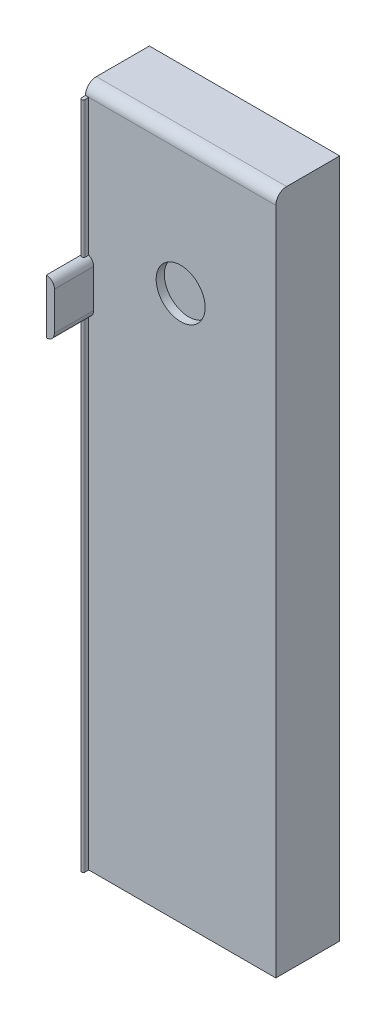
ISO-10303-21;
HEADER;
FILE_DESCRIPTION(('STEP AP214'),'2;1');
FILE_NAME('part.step','',(''),(''),'','','');
FILE_SCHEMA(('AUTOMOTIVE_DESIGN { 1 0 10303 214 1 1 1 1 }'));
ENDSEC;
DATA;
#1=APPLICATION_CONTEXT('core data for automotive mechanical design processes');
#2=APPLICATION_PROTOCOL_DEFINITION('international standard','automotive_design',2000,#1);
#3=PRODUCT_CONTEXT('',#1,'mechanical');
#4=PRODUCT('Part','Part','',(#3));
#5=PRODUCT_RELATED_PRODUCT_CATEGORY('part','',(#4));
#6=PRODUCT_DEFINITION_FORMATION('','',#4);
#7=PRODUCT_DEFINITION_CONTEXT('part definition',#1,'design');
#8=PRODUCT_DEFINITION('design','',#6,#7);
#9=PRODUCT_DEFINITION_SHAPE('','',#8);
#10=(LENGTH_UNIT() NAMED_UNIT(*) SI_UNIT(.MILLI.,.METRE.));
#11=(NAMED_UNIT(*) PLANE_ANGLE_UNIT() SI_UNIT($,.RADIAN.));
#12=(NAMED_UNIT(*) SI_UNIT($,.STERADIAN.) SOLID_ANGLE_UNIT());
#13=UNCERTAINTY_MEASURE_WITH_UNIT(LENGTH_MEASURE(1.E-05),#10,'distance_accuracy_value','');
#14=(GEOMETRIC_REPRESENTATION_CONTEXT(3) GLOBAL_UNCERTAINTY_ASSIGNED_CONTEXT((#13)) GLOBAL_UNIT_ASSIGNED_CONTEXT((#10,
#11,#12)) REPRESENTATION_CONTEXT('',''));
#15=CARTESIAN_POINT('',(0.,0.,0.));
#16=DIRECTION('',(0.,0.,1.));
#17=DIRECTION('',(1.,0.,0.));
#18=AXIS2_PLACEMENT_3D('',#15,#16,#17);
#19=CARTESIAN_POINT('',(-175.,270.25,-2.00025181603299E-13));
#20=DIRECTION('',(0.,0.,1.));
#21=DIRECTION('',(0.,-1.,0.));
#22=AXIS2_PLACEMENT_3D('',#19,#20,#21);
#23=CYLINDRICAL_SURFACE('',#22,15.);
#24=DIRECTION('',(0.,0.,-1.));
#25=VECTOR('',#24,1.);
#26=CARTESIAN_POINT('',(-160.,270.25,-2.00025181603299E-13));
#27=LINE('',#26,#25);
#28=CARTESIAN_POINT('',(-160.,270.25,189.586261152652));
#29=VERTEX_POINT('',#28);
#30=CARTESIAN_POINT('',(-160.,270.25,117.5));
#31=VERTEX_POINT('',#30);
#32=EDGE_CURVE('E473',#29,#31,#27,.T.);
#33=ORIENTED_EDGE('',*,*,#32,.F.);
#34=CARTESIAN_POINT('',(-175.,270.25,189.586261152652));
#35=DIRECTION('',(0.,0.,-1.));
#36=DIRECTION('',(0.,1.,0.));
#37=AXIS2_PLACEMENT_3D('',#34,#35,#36);
#38=CIRCLE('',#37,15.);
#39=CARTESIAN_POINT('',(-175.,255.25,189.586261152652));
#40=VERTEX_POINT('',#39);
#41=EDGE_CURVE('E389',#40,#29,#38,.F.);
#42=ORIENTED_EDGE('',*,*,#41,.F.);
#43=DIRECTION('',(0.,0.,1.));
#44=VECTOR('',#43,1.);
#45=CARTESIAN_POINT('',(-175.,255.25,-1.88922951357047E-13));
#46=LINE('',#45,#44);
#47=CARTESIAN_POINT('',(-175.,255.25,124.5));
#48=VERTEX_POINT('',#47);
#49=EDGE_CURVE('E398',#48,#40,#46,.T.);
#50=ORIENTED_EDGE('',*,*,#49,.F.);
#51=CARTESIAN_POINT('',(-175.,255.25,124.5));
#52=CARTESIAN_POINT('',(-175.000008065944,255.250005294652,124.58434332799));
#53=CARTESIAN_POINT('',(-174.996443128427,255.250000138159,124.668682818921));
#54=CARTESIAN_POINT('',(-174.982229678689,255.250007442468,124.836759033892));
#55=CARTESIAN_POINT('',(-174.971581493432,255.250019902459,124.920495785574));
#56=CARTESIAN_POINT('',(-174.943272633368,255.250100927907,125.086728450454));
#57=CARTESIAN_POINT('',(-174.925616253457,255.250169459029,125.169225091562));
#58=CARTESIAN_POINT('',(-174.883434272909,255.25043824211,125.332418002477));
#59=CARTESIAN_POINT('',(-174.858908755877,255.250638492465,125.413114294183));
#60=CARTESIAN_POINT('',(-174.775226018218,255.251578715945,125.651725687774));
#61=CARTESIAN_POINT('',(-174.705951300325,255.252658052006,125.806229373665));
#62=CARTESIAN_POINT('',(-174.542512989983,255.25675685704,126.101282032483));
#63=CARTESIAN_POINT('',(-174.448354861293,255.259775900311,126.241834059528));
#64=CARTESIAN_POINT('',(-174.238014788756,255.268998308329,126.504889795844));
#65=CARTESIAN_POINT('',(-174.12187009139,255.275196317653,126.627423414424));
#66=CARTESIAN_POINT('',(-173.870870982891,255.292030479642,126.851194532496));
#67=CARTESIAN_POINT('',(-173.73601508496,255.302666985128,126.952430338047));
#68=CARTESIAN_POINT('',(-173.452658069625,255.329349441035,127.13012461852));
#69=CARTESIAN_POINT('',(-173.304257990698,255.345357392947,127.206749939508));
#70=CARTESIAN_POINT('',(-172.997512382047,255.383463630683,127.334175357897));
#71=CARTESIAN_POINT('',(-172.83916789866,255.405561276582,127.38497816721));
#72=CARTESIAN_POINT('',(-172.517425737389,255.45597085815,127.459647888889));
#73=CARTESIAN_POINT('',(-172.354034249541,255.48427542235,127.483546548418));
#74=CARTESIAN_POINT('',(-172.026654022785,255.546701252979,127.50436430957));
#75=CARTESIAN_POINT('',(-171.862665207158,255.580823294348,127.501279814042));
#76=CARTESIAN_POINT('',(-171.534887873997,255.65473227175,127.468399458056));
#77=CARTESIAN_POINT('',(-171.371182710244,255.694627082292,127.438018959584));
#78=CARTESIAN_POINT('',(-171.051851823505,255.777979057153,127.351037951955));
#79=CARTESIAN_POINT('',(-170.896227625008,255.821436889683,127.294432515258));
#80=CARTESIAN_POINT('',(-170.590775776857,255.911760579881,127.153951755461));
#81=CARTESIAN_POINT('',(-170.441425389939,255.958693237877,127.069080699656));
#82=CARTESIAN_POINT('',(-170.159137596351,256.051824775746,126.874989282917));
#83=CARTESIAN_POINT('',(-170.026206187457,256.098023382136,126.765760064699));
#84=CARTESIAN_POINT('',(-169.777996901248,256.187694202226,126.523214112286));
#85=CARTESIAN_POINT('',(-169.663101754118,256.231098070025,126.389479740076));
#86=CARTESIAN_POINT('',(-169.457738387998,256.311007145604,126.1024823404));
#87=CARTESIAN_POINT('',(-169.367257351145,256.347515970375,125.949229622889));
#88=CARTESIAN_POINT('',(-169.254148529436,256.394071515153,125.711452602186));
#89=CARTESIAN_POINT('',(-169.220712507061,256.408002430988,125.63266143957));
#90=CARTESIAN_POINT('',(-169.160590900125,256.433257729979,125.472154137239));
#91=CARTESIAN_POINT('',(-169.133902025312,256.444583383349,125.390439445464));
#92=CARTESIAN_POINT('',(-169.087573619552,256.464360746757,125.224694071499));
#93=CARTESIAN_POINT('',(-169.06793452232,256.472812279972,125.140663247158));
#94=CARTESIAN_POINT('',(-169.03594984177,256.486627943955,124.971011351026));
#95=CARTESIAN_POINT('',(-169.023600668677,256.49199359427,124.885391083385));
#96=CARTESIAN_POINT('',(-169.00701203328,256.499212023815,124.719968607042));
#97=CARTESIAN_POINT('',(-169.002216265528,256.501305677849,124.640232141686));
#98=CARTESIAN_POINT('',(-168.999000684638,256.502709063753,124.48060626696));
#99=CARTESIAN_POINT('',(-169.00058067034,256.502018883454,124.400716862495));
#100=CARTESIAN_POINT('',(-169.010113999384,256.49786188508,124.241202595755));
#101=CARTESIAN_POINT('',(-169.018082535078,256.494388448267,124.161578818931));
#102=CARTESIAN_POINT('',(-169.040310550361,256.484746297593,124.00337191526));
#103=CARTESIAN_POINT('',(-169.054570567933,256.478577353241,123.924788877998));
#104=CARTESIAN_POINT('',(-169.071924910384,256.471105787043,123.847025062068));
#105=B_SPLINE_CURVE_WITH_KNOTS('',3,(#51,#52,#53,#54,#55,#56,#57,#58,#59,#60,#61,#62,#63,#64,
#65,#66,#67,#68,#69,#70,#71,#72,#73,#74,#75,#76,#77,#78,#79,#80,#81,#82,#83,#84,#85,#86,#87,#88,
#89,#90,#91,#92,#93,#94,#95,#96,#97,#98,#99,#100,#101,#102,#103,#104),.UNSPECIFIED.,.F.,.F.,(4,
2,2,2,2,2,2,2,2,2,2,2,2,2,2,2,2,2,2,2,2,2,2,2,2,2,4),(0.,0.252947747100097,0.505883818886723,
0.758665120323477,1.01144334533151,1.51680124761068,2.02204827833762,2.52644693012972,
3.03088568457711,3.5318286568019,4.03271900850782,4.53301768307255,5.03338305395432,
5.54472786127518,6.05616878681059,6.5879663306204,7.11995756660124,7.66204081403238,
8.20383890142679,8.46370857310641,8.72345127364108,8.98320995134616,9.24284060925329,
9.48226707125166,9.72168597919915,9.96167593434058,10.2016864149094),.UNSPECIFIED.);
#106=CARTESIAN_POINT('',(-169.,256.502272915132,124.5));
#107=VERTEX_POINT('',#106);
#108=EDGE_CURVE('E381',#107,#48,#105,.F.);
#109=ORIENTED_EDGE('',*,*,#108,.F.);
#110=DIRECTION('',(0.,0.,1.));
#111=VECTOR('',#110,1.);
#112=CARTESIAN_POINT('',(-169.,256.502272915132,-1.89849819506044E-13));
#113=LINE('',#112,#111);
#114=CARTESIAN_POINT('',(-169.,256.502272915132,117.5));
#115=VERTEX_POINT('',#114);
#116=EDGE_CURVE('E124',#115,#107,#113,.T.);
#117=ORIENTED_EDGE('',*,*,#116,.F.);
#118=CARTESIAN_POINT('',(-175.,270.25,117.5));
#119=DIRECTION('',(0.,0.,-1.));
#120=DIRECTION('',(-1.,0.,0.));
#121=AXIS2_PLACEMENT_3D('',#118,#119,#120);
#122=CIRCLE('',#121,15.);
#123=EDGE_CURVE('E12',#115,#31,#122,.F.);
#124=ORIENTED_EDGE('',*,*,#123,.T.);
#125=EDGE_LOOP('',(#33,#42,#50,#109,#117,#124));
#126=FACE_BOUND('',#125,.T.);
#127=ADVANCED_FACE('F112',(#126),#23,.T.);
#128=CARTESIAN_POINT('',(-175.,340.25,0.));
#129=DIRECTION('',(0.,0.,-1.));
#130=DIRECTION('',(-1.,0.,0.));
#131=AXIS2_PLACEMENT_3D('',#128,#129,#130);
#132=CYLINDRICAL_SURFACE('',#131,15.);
#133=DIRECTION('',(0.,0.,-1.));
#134=VECTOR('',#133,1.);
#135=CARTESIAN_POINT('',(-160.,340.25,0.));
#136=LINE('',#135,#134);
#137=CARTESIAN_POINT('',(-160.,340.25,117.5));
#138=VERTEX_POINT('',#137);
#139=CARTESIAN_POINT('',(-160.,340.25,189.586261152652));
#140=VERTEX_POINT('',#139);
#141=EDGE_CURVE('E350',#138,#140,#136,.F.);
#142=ORIENTED_EDGE('',*,*,#141,.F.);
#143=CARTESIAN_POINT('',(-175.,340.25,117.5));
#144=DIRECTION('',(0.,0.,-1.));
#145=DIRECTION('',(-1.,0.,0.));
#146=AXIS2_PLACEMENT_3D('',#143,#144,#145);
#147=CIRCLE('',#146,15.);
#148=CARTESIAN_POINT('',(-169.,353.997727084867,117.5));
#149=VERTEX_POINT('',#148);
#150=EDGE_CURVE('E472',#138,#149,#147,.F.);
#151=ORIENTED_EDGE('',*,*,#150,.T.);
#152=DIRECTION('',(0.,0.,-1.));
#153=VECTOR('',#152,1.);
#154=CARTESIAN_POINT('',(-169.,353.997727084867,0.));
#155=LINE('',#154,#153);
#156=CARTESIAN_POINT('',(-169.,353.997727084867,124.5));
#157=VERTEX_POINT('',#156);
#158=EDGE_CURVE('E257',#157,#149,#155,.T.);
#159=ORIENTED_EDGE('',*,*,#158,.F.);
#160=CARTESIAN_POINT('',(-175.,355.25,124.5));
#161=CARTESIAN_POINT('',(-175.000008065944,355.249994705347,124.58434332799));
#162=CARTESIAN_POINT('',(-174.996443128427,355.249999861841,124.668682818921));
#163=CARTESIAN_POINT('',(-174.982229678689,355.249992557532,124.836759033892));
#164=CARTESIAN_POINT('',(-174.971581493432,355.249980097541,124.920495785574));
#165=CARTESIAN_POINT('',(-174.943272633368,355.249899072093,125.086728450454));
#166=CARTESIAN_POINT('',(-174.925616253457,355.24983054097,125.169225091562));
#167=CARTESIAN_POINT('',(-174.883434272909,355.24956175789,125.332418002477));
#168=CARTESIAN_POINT('',(-174.858908755877,355.249361507534,125.413114294183));
#169=CARTESIAN_POINT('',(-174.775226018218,355.248421284055,125.651725687774));
#170=CARTESIAN_POINT('',(-174.705951300325,355.247341947994,125.806229373665));
#171=CARTESIAN_POINT('',(-174.542512989984,355.24324314296,126.101282032483));
#172=CARTESIAN_POINT('',(-174.448354861293,355.240224099689,126.241834059528));
#173=CARTESIAN_POINT('',(-174.238014788756,355.231001691671,126.504889795844));
#174=CARTESIAN_POINT('',(-174.12187009139,355.224803682347,126.627423414424));
#175=CARTESIAN_POINT('',(-173.870870982891,355.207969520358,126.851194532496));
#176=CARTESIAN_POINT('',(-173.73601508496,355.197333014872,126.952430338047));
#177=CARTESIAN_POINT('',(-173.452658069625,355.170650558965,127.13012461852));
#178=CARTESIAN_POINT('',(-173.304257990698,355.154642607052,127.206749939508));
#179=CARTESIAN_POINT('',(-172.997512382047,355.116536369317,127.334175357897));
#180=CARTESIAN_POINT('',(-172.83916789866,355.094438723417,127.38497816721));
#181=CARTESIAN_POINT('',(-172.517425737389,355.04402914185,127.459647888889));
#182=CARTESIAN_POINT('',(-172.354034249541,355.01572457765,127.483546548418));
#183=CARTESIAN_POINT('',(-172.026654022785,354.953298747021,127.50436430957));
#184=CARTESIAN_POINT('',(-171.862665207158,354.919176705652,127.501279814042));
#185=CARTESIAN_POINT('',(-171.534887873997,354.84526772825,127.468399458056));
#186=CARTESIAN_POINT('',(-171.371182710244,354.805372917708,127.438018959584));
#187=CARTESIAN_POINT('',(-171.051851823505,354.722020942847,127.351037951955));
#188=CARTESIAN_POINT('',(-170.896227625008,354.678563110317,127.294432515258));
#189=CARTESIAN_POINT('',(-170.590775776857,354.588239420119,127.153951755461));
#190=CARTESIAN_POINT('',(-170.441425389939,354.541306762123,127.069080699656));
#191=CARTESIAN_POINT('',(-170.159137596351,354.448175224254,126.874989282917));
#192=CARTESIAN_POINT('',(-170.026206187457,354.401976617864,126.765760064699));
#193=CARTESIAN_POINT('',(-169.777996901248,354.312305797774,126.523214112286));
#194=CARTESIAN_POINT('',(-169.663101754118,354.268901929975,126.389479740076));
#195=CARTESIAN_POINT('',(-169.457738387998,354.188992854396,126.1024823404));
#196=CARTESIAN_POINT('',(-169.367257351145,354.152484029625,125.949229622889));
#197=CARTESIAN_POINT('',(-169.254148529436,354.105928484847,125.711452602186));
#198=CARTESIAN_POINT('',(-169.220712507061,354.091997569012,125.63266143957));
#199=CARTESIAN_POINT('',(-169.160590900125,354.06674227002,125.472154137239));
#200=CARTESIAN_POINT('',(-169.133902025312,354.055416616651,125.390439445464));
#201=CARTESIAN_POINT('',(-169.087573619552,354.035639253243,125.224694071499));
#202=CARTESIAN_POINT('',(-169.06793452232,354.027187720028,125.140663247158));
#203=CARTESIAN_POINT('',(-169.03594984177,354.013372056045,124.971011351026));
#204=CARTESIAN_POINT('',(-169.023600668677,354.00800640573,124.885391083385));
#205=CARTESIAN_POINT('',(-169.00701203328,354.000787976185,124.719968607042));
#206=CARTESIAN_POINT('',(-169.002216265528,353.99869432215,124.640232141686));
#207=CARTESIAN_POINT('',(-168.999000684638,353.997290936247,124.48060626696));
#208=CARTESIAN_POINT('',(-169.00058067034,353.997981116546,124.400716862495));
#209=CARTESIAN_POINT('',(-169.010113999384,354.00213811492,124.241202595755));
#210=CARTESIAN_POINT('',(-169.018082535078,354.005611551733,124.161578818931));
#211=CARTESIAN_POINT('',(-169.040310550361,354.015253702407,124.00337191526));
#212=CARTESIAN_POINT('',(-169.054570567933,354.021422646759,123.924788877998));
#213=CARTESIAN_POINT('',(-169.071924910384,354.028894212957,123.847025062068));
#214=B_SPLINE_CURVE_WITH_KNOTS('',3,(#160,#161,#162,#163,#164,#165,#166,#167,#168,#169,#170,
#171,#172,#173,#174,#175,#176,#177,#178,#179,#180,#181,#182,#183,#184,#185,#186,#187,#188,#189,
#190,#191,#192,#193,#194,#195,#196,#197,#198,#199,#200,#201,#202,#203,#204,#205,#206,#207,#208,
#209,#210,#211,#212,#213),.UNSPECIFIED.,.F.,.F.,(4,2,2,2,2,2,2,2,2,2,2,2,2,2,2,2,2,2,2,2,2,2,2,
2,2,2,4),(0.,0.252947747100097,0.505883818886723,0.758665120323449,1.0114433453315,
1.51680124761067,2.02204827833763,2.52644693012975,3.0308856845771,3.53182865680193,
4.03271900850785,4.53301768307256,5.03338305395431,5.54472786127518,6.05616878681061,
6.58796633062037,7.11995756660123,7.66204081403235,8.20383890142676,8.46370857310642,
8.7234512736411,8.98320995134616,9.24284060925333,9.48226707125172,9.72168597919919,
9.96167593434062,10.2016864149094),.UNSPECIFIED.);
#215=CARTESIAN_POINT('',(-175.,355.25,124.5));
#216=VERTEX_POINT('',#215);
#217=EDGE_CURVE('E353',#216,#157,#214,.T.);
#218=ORIENTED_EDGE('',*,*,#217,.F.);
#219=DIRECTION('',(0.,0.,1.));
#220=VECTOR('',#219,1.);
#221=CARTESIAN_POINT('',(-175.,355.25,0.));
#222=LINE('',#221,#220);
#223=CARTESIAN_POINT('',(-175.,355.25,189.586261152653));
#224=VERTEX_POINT('',#223);
#225=EDGE_CURVE('E459',#216,#224,#222,.T.);
#226=ORIENTED_EDGE('',*,*,#225,.T.);
#227=CARTESIAN_POINT('',(-175.,340.25,189.586261152652));
#228=DIRECTION('',(0.,0.,-1.));
#229=DIRECTION('',(0.,1.,0.));
#230=AXIS2_PLACEMENT_3D('',#227,#228,#229);
#231=CIRCLE('',#230,15.);
#232=EDGE_CURVE('E354',#140,#224,#231,.F.);
#233=ORIENTED_EDGE('',*,*,#232,.F.);
#234=EDGE_LOOP('',(#142,#151,#159,#218,#226,#233));
#235=FACE_BOUND('',#234,.T.);
#236=ADVANCED_FACE('F364',(#235),#132,.T.);
#237=CARTESIAN_POINT('',(-172.,255.25,124.5));
#238=DIRECTION('',(0.,-1.,0.));
#239=DIRECTION('',(0.,0.,-1.));
#240=AXIS2_PLACEMENT_3D('',#237,#238,#239);
#241=CYLINDRICAL_SURFACE('',#240,3.);
#242=DIRECTION('',(0.,-1.,0.));
#243=VECTOR('',#242,1.);
#244=CARTESIAN_POINT('',(-169.,0.,124.5));
#245=LINE('',#244,#243);
#246=CARTESIAN_POINT('',(-169.,-625.25,124.5));
#247=VERTEX_POINT('',#246);
#248=EDGE_CURVE('E139',#107,#247,#245,.T.);
#249=ORIENTED_EDGE('',*,*,#248,.F.);
#250=ORIENTED_EDGE('',*,*,#108,.T.);
#251=DIRECTION('',(0.,-1.,0.));
#252=VECTOR('',#251,1.);
#253=CARTESIAN_POINT('',(-175.,-625.25,124.5));
#254=LINE('',#253,#252);
#255=CARTESIAN_POINT('',(-175.,-625.25,124.5));
#256=VERTEX_POINT('',#255);
#257=EDGE_CURVE('E344',#256,#48,#254,.F.);
#258=ORIENTED_EDGE('',*,*,#257,.F.);
#259=CARTESIAN_POINT('',(-172.,-625.25,124.5));
#260=DIRECTION('',(0.,1.,0.));
#261=DIRECTION('',(0.,0.,1.));
#262=AXIS2_PLACEMENT_3D('',#259,#260,#261);
#263=CIRCLE('',#262,3.);
#264=EDGE_CURVE('E349',#247,#256,#263,.F.);
#265=ORIENTED_EDGE('',*,*,#264,.F.);
#266=EDGE_LOOP('',(#249,#250,#258,#265));
#267=FACE_BOUND('',#266,.T.);
#268=ADVANCED_FACE('F374',(#267),#241,.T.);
#269=CARTESIAN_POINT('',(-172.,605.25,124.5));
#270=DIRECTION('',(0.,-1.,0.));
#271=DIRECTION('',(0.,0.,-1.));
#272=AXIS2_PLACEMENT_3D('',#269,#270,#271);
#273=CYLINDRICAL_SURFACE('',#272,3.);
#274=DIRECTION('',(0.,-1.,0.));
#275=VECTOR('',#274,1.);
#276=CARTESIAN_POINT('',(-169.,0.,124.5));
#277=LINE('',#276,#275);
#278=CARTESIAN_POINT('',(-169.,605.25,124.5));
#279=VERTEX_POINT('',#278);
#280=EDGE_CURVE('E336',#279,#157,#277,.T.);
#281=ORIENTED_EDGE('',*,*,#280,.F.);
#282=CARTESIAN_POINT('',(-172.,605.25,124.5));
#283=DIRECTION('',(0.,1.,0.));
#284=DIRECTION('',(0.,0.,1.));
#285=AXIS2_PLACEMENT_3D('',#282,#283,#284);
#286=CIRCLE('',#285,3.);
#287=CARTESIAN_POINT('',(-175.,605.25,124.5));
#288=VERTEX_POINT('',#287);
#289=EDGE_CURVE('E248',#288,#279,#286,.T.);
#290=ORIENTED_EDGE('',*,*,#289,.F.);
#291=DIRECTION('',(0.,-1.,0.));
#292=VECTOR('',#291,1.);
#293=CARTESIAN_POINT('',(-175.,-625.25,124.5));
#294=LINE('',#293,#292);
#295=EDGE_CURVE('E338',#216,#288,#294,.F.);
#296=ORIENTED_EDGE('',*,*,#295,.F.);
#297=ORIENTED_EDGE('',*,*,#217,.T.);
#298=EDGE_LOOP('',(#281,#290,#296,#297));
#299=FACE_BOUND('',#298,.T.);
#300=ADVANCED_FACE('F368',(#299),#273,.T.);
#301=CARTESIAN_POINT('',(0.,0.,117.5));
#302=DIRECTION('',(0.,0.,-1.));
#303=DIRECTION('',(-1.,0.,0.));
#304=AXIS2_PLACEMENT_3D('',#301,#302,#303);
#305=PLANE('',#304);
#306=ORIENTED_EDGE('',*,*,#123,.F.);
#307=DIRECTION('',(0.,1.,0.));
#308=VECTOR('',#307,1.);
#309=CARTESIAN_POINT('',(-169.,0.,117.5));
#310=LINE('',#309,#308);
#311=CARTESIAN_POINT('',(-169.,-625.25,117.5));
#312=VERTEX_POINT('',#311);
#313=EDGE_CURVE('E129',#312,#115,#310,.T.);
#314=ORIENTED_EDGE('',*,*,#313,.F.);
#315=DIRECTION('',(1.,0.,0.));
#316=VECTOR('',#315,1.);
#317=CARTESIAN_POINT('',(-175.,-625.25,117.5));
#318=LINE('',#317,#316);
#319=CARTESIAN_POINT('',(175.,-625.25,117.5));
#320=VERTEX_POINT('',#319);
#321=EDGE_CURVE('E417',#312,#320,#318,.T.);
#322=ORIENTED_EDGE('',*,*,#321,.T.);
#323=DIRECTION('',(0.,1.,0.));
#324=VECTOR('',#323,1.);
#325=CARTESIAN_POINT('',(175.,-625.25,117.5));
#326=LINE('',#325,#324);
#327=CARTESIAN_POINT('',(175.,605.25,117.5));
#328=VERTEX_POINT('',#327);
#329=EDGE_CURVE('E276',#320,#328,#326,.T.);
#330=ORIENTED_EDGE('',*,*,#329,.T.);
#331=DIRECTION('',(1.,0.,0.));
#332=VECTOR('',#331,1.);
#333=CARTESIAN_POINT('',(0.,605.25,117.5));
#334=LINE('',#333,#332);
#335=CARTESIAN_POINT('',(-169.,605.25,117.5));
#336=VERTEX_POINT('',#335);
#337=EDGE_CURVE('E269',#328,#336,#334,.F.);
#338=ORIENTED_EDGE('',*,*,#337,.T.);
#339=DIRECTION('',(0.,1.,0.));
#340=VECTOR('',#339,1.);
#341=CARTESIAN_POINT('',(-169.,0.,117.5));
#342=LINE('',#341,#340);
#343=EDGE_CURVE('E255',#149,#336,#342,.T.);
#344=ORIENTED_EDGE('',*,*,#343,.F.);
#345=ORIENTED_EDGE('',*,*,#150,.F.);
#346=DIRECTION('',(0.,1.,0.));
#347=VECTOR('',#346,1.);
#348=CARTESIAN_POINT('',(-160.,0.,117.5));
#349=LINE('',#348,#347);
#350=EDGE_CURVE('E293',#31,#138,#349,.T.);
#351=ORIENTED_EDGE('',*,*,#350,.F.);
#352=EDGE_LOOP('',(#306,#314,#322,#330,#338,#344,#345,#351));
#353=FACE_BOUND('',#352,.T.);
#354=CARTESIAN_POINT('',(0.,377.49,117.5));
#355=DIRECTION('',(0.,0.,1.));
#356=DIRECTION('',(1.,0.,0.));
#357=AXIS2_PLACEMENT_3D('',#354,#355,#356);
#358=CIRCLE('',#357,45.);
#359=CARTESIAN_POINT('',(45.,377.49,117.5));
#360=VERTEX_POINT('',#359);
#361=EDGE_CURVE('E449',#360,#360,#358,.T.);
#362=ORIENTED_EDGE('',*,*,#361,.F.);
#363=EDGE_LOOP('',(#362));
#364=FACE_BOUND('',#363,.T.);
#365=ADVANCED_FACE('F271',(#353,#364),#305,.F.);
#366=CARTESIAN_POINT('',(-175.,605.25,97.5));
#367=DIRECTION('',(1.,0.,0.));
#368=DIRECTION('',(0.,0.,-1.));
#369=AXIS2_PLACEMENT_3D('',#366,#367,#368);
#370=CYLINDRICAL_SURFACE('',#369,20.);
#371=DIRECTION('',(1.,0.,0.));
#372=VECTOR('',#371,1.);
#373=CARTESIAN_POINT('',(-175.,625.25,97.5));
#374=LINE('',#373,#372);
#375=CARTESIAN_POINT('',(-175.,625.25,97.5));
#376=VERTEX_POINT('',#375);
#377=CARTESIAN_POINT('',(175.,625.25,97.5));
#378=VERTEX_POINT('',#377);
#379=EDGE_CURVE('E280',#376,#378,#374,.T.);
#380=ORIENTED_EDGE('',*,*,#379,.F.);
#381=CARTESIAN_POINT('',(-175.,605.25,97.5));
#382=DIRECTION('',(1.,0.,0.));
#383=DIRECTION('',(0.,0.,-1.));
#384=AXIS2_PLACEMENT_3D('',#381,#382,#383);
#385=CIRCLE('',#384,20.);
#386=CARTESIAN_POINT('',(-175.,605.25,117.5));
#387=VERTEX_POINT('',#386);
#388=EDGE_CURVE('E268',#387,#376,#385,.F.);
#389=ORIENTED_EDGE('',*,*,#388,.F.);
#390=DIRECTION('',(-1.,0.,0.));
#391=VECTOR('',#390,1.);
#392=CARTESIAN_POINT('',(-169.,605.25,117.5));
#393=LINE('',#392,#391);
#394=EDGE_CURVE('E250',#336,#387,#393,.T.);
#395=ORIENTED_EDGE('',*,*,#394,.F.);
#396=ORIENTED_EDGE('',*,*,#337,.F.);
#397=CARTESIAN_POINT('',(175.,605.25,97.5));
#398=DIRECTION('',(-1.,0.,0.));
#399=DIRECTION('',(0.,0.,1.));
#400=AXIS2_PLACEMENT_3D('',#397,#398,#399);
#401=CIRCLE('',#400,20.);
#402=EDGE_CURVE('E278',#378,#328,#401,.F.);
#403=ORIENTED_EDGE('',*,*,#402,.F.);
#404=EDGE_LOOP('',(#380,#389,#395,#396,#403));
#405=FACE_BOUND('',#404,.T.);
#406=ADVANCED_FACE('F270',(#405),#370,.T.);
#407=CARTESIAN_POINT('',(175.,-625.25,117.5));
#408=DIRECTION('',(-1.,0.,0.));
#409=DIRECTION('',(0.,0.,1.));
#410=AXIS2_PLACEMENT_3D('',#407,#408,#409);
#411=PLANE('',#410);
#412=DIRECTION('',(0.,0.,-1.));
#413=VECTOR('',#412,1.);
#414=CARTESIAN_POINT('',(175.,625.25,117.5));
#415=LINE('',#414,#413);
#416=CARTESIAN_POINT('',(175.,625.25,0.));
#417=VERTEX_POINT('',#416);
#418=EDGE_CURVE('E282',#378,#417,#415,.T.);
#419=ORIENTED_EDGE('',*,*,#418,.F.);
#420=ORIENTED_EDGE('',*,*,#402,.T.);
#421=ORIENTED_EDGE('',*,*,#329,.F.);
#422=DIRECTION('',(0.,0.,-1.));
#423=VECTOR('',#422,1.);
#424=CARTESIAN_POINT('',(175.,-625.25,117.5));
#425=LINE('',#424,#423);
#426=CARTESIAN_POINT('',(175.,-625.25,0.));
#427=VERTEX_POINT('',#426);
#428=EDGE_CURVE('E412',#320,#427,#425,.T.);
#429=ORIENTED_EDGE('',*,*,#428,.T.);
#430=DIRECTION('',(0.,1.,0.));
#431=VECTOR('',#430,1.);
#432=CARTESIAN_POINT('',(175.,-625.25,0.));
#433=LINE('',#432,#431);
#434=EDGE_CURVE('E431',#427,#417,#433,.T.);
#435=ORIENTED_EDGE('',*,*,#434,.T.);
#436=EDGE_LOOP('',(#419,#420,#421,#429,#435));
#437=FACE_BOUND('',#436,.T.);
#438=ADVANCED_FACE('F433',(#437),#411,.F.);
#439=CARTESIAN_POINT('',(-175.,625.25,117.5));
#440=DIRECTION('',(0.,-1.,0.));
#441=DIRECTION('',(0.,0.,-1.));
#442=AXIS2_PLACEMENT_3D('',#439,#440,#441);
#443=PLANE('',#442);
#444=DIRECTION('',(0.,0.,-1.));
#445=VECTOR('',#444,1.);
#446=CARTESIAN_POINT('',(-175.,625.25,117.5));
#447=LINE('',#446,#445);
#448=CARTESIAN_POINT('',(-175.,625.25,0.));
#449=VERTEX_POINT('',#448);
#450=EDGE_CURVE('E411',#376,#449,#447,.T.);
#451=ORIENTED_EDGE('',*,*,#450,.F.);
#452=ORIENTED_EDGE('',*,*,#379,.T.);
#453=ORIENTED_EDGE('',*,*,#418,.T.);
#454=DIRECTION('',(-1.,0.,0.));
#455=VECTOR('',#454,1.);
#456=CARTESIAN_POINT('',(-175.,625.25,0.));
#457=LINE('',#456,#455);
#458=EDGE_CURVE('E424',#417,#449,#457,.T.);
#459=ORIENTED_EDGE('',*,*,#458,.T.);
#460=EDGE_LOOP('',(#451,#452,#453,#459));
#461=FACE_BOUND('',#460,.T.);
#462=ADVANCED_FACE('F425',(#461),#443,.F.);
#463=CARTESIAN_POINT('',(-175.,-625.25,117.5));
#464=DIRECTION('',(1.,0.,0.));
#465=DIRECTION('',(0.,0.,-1.));
#466=AXIS2_PLACEMENT_3D('',#463,#464,#465);
#467=PLANE('',#466);
#468=DIRECTION('',(0.,0.,-1.));
#469=VECTOR('',#468,1.);
#470=CARTESIAN_POINT('',(-175.,-625.25,117.5));
#471=LINE('',#470,#469);
#472=CARTESIAN_POINT('',(-175.,-625.25,0.));
#473=VERTEX_POINT('',#472);
#474=EDGE_CURVE('E403',#256,#473,#471,.T.);
#475=ORIENTED_EDGE('',*,*,#474,.F.);
#476=ORIENTED_EDGE('',*,*,#257,.T.);
#477=ORIENTED_EDGE('',*,*,#49,.T.);
#478=DIRECTION('',(0.,-1.,0.));
#479=VECTOR('',#478,1.);
#480=CARTESIAN_POINT('',(-175.,0.,189.586261152652));
#481=LINE('',#480,#479);
#482=EDGE_CURVE('E453',#224,#40,#481,.T.);
#483=ORIENTED_EDGE('',*,*,#482,.F.);
#484=ORIENTED_EDGE('',*,*,#225,.F.);
#485=ORIENTED_EDGE('',*,*,#295,.T.);
#486=DIRECTION('',(0.,0.,-1.));
#487=VECTOR('',#486,1.);
#488=CARTESIAN_POINT('',(-175.,605.25,0.));
#489=LINE('',#488,#487);
#490=EDGE_CURVE('E254',#288,#387,#489,.T.);
#491=ORIENTED_EDGE('',*,*,#490,.T.);
#492=ORIENTED_EDGE('',*,*,#388,.T.);
#493=ORIENTED_EDGE('',*,*,#450,.T.);
#494=DIRECTION('',(0.,-1.,0.));
#495=VECTOR('',#494,1.);
#496=CARTESIAN_POINT('',(-175.,-625.25,0.));
#497=LINE('',#496,#495);
#498=EDGE_CURVE('E407',#449,#473,#497,.T.);
#499=ORIENTED_EDGE('',*,*,#498,.T.);
#500=EDGE_LOOP('',(#475,#476,#477,#483,#484,#485,#491,#492,#493,#499));
#501=FACE_BOUND('',#500,.T.);
#502=ADVANCED_FACE('F406',(#501),#467,.F.);
#503=CARTESIAN_POINT('',(-175.,-625.25,117.5));
#504=DIRECTION('',(0.,1.,0.));
#505=DIRECTION('',(0.,0.,1.));
#506=AXIS2_PLACEMENT_3D('',#503,#504,#505);
#507=PLANE('',#506);
#508=DIRECTION('',(0.,0.,-1.));
#509=VECTOR('',#508,1.);
#510=CARTESIAN_POINT('',(-169.,-625.25,0.));
#511=LINE('',#510,#509);
#512=EDGE_CURVE('E272',#247,#312,#511,.T.);
#513=ORIENTED_EDGE('',*,*,#512,.F.);
#514=ORIENTED_EDGE('',*,*,#264,.T.);
#515=ORIENTED_EDGE('',*,*,#474,.T.);
#516=DIRECTION('',(1.,0.,0.));
#517=VECTOR('',#516,1.);
#518=CARTESIAN_POINT('',(-175.,-625.25,0.));
#519=LINE('',#518,#517);
#520=EDGE_CURVE('E442',#473,#427,#519,.T.);
#521=ORIENTED_EDGE('',*,*,#520,.T.);
#522=ORIENTED_EDGE('',*,*,#428,.F.);
#523=ORIENTED_EDGE('',*,*,#321,.F.);
#524=EDGE_LOOP('',(#513,#514,#515,#521,#522,#523));
#525=FACE_BOUND('',#524,.T.);
#526=ADVANCED_FACE('F470',(#525),#507,.F.);
#527=CARTESIAN_POINT('',(0.,0.,0.));
#528=DIRECTION('',(0.,0.,-1.));
#529=DIRECTION('',(-1.,0.,0.));
#530=AXIS2_PLACEMENT_3D('',#527,#528,#529);
#531=PLANE('',#530);
#532=CARTESIAN_POINT('',(0.,-442.,0.));
#533=DIRECTION('',(0.,0.,-1.));
#534=DIRECTION('',(-1.,0.,0.));
#535=AXIS2_PLACEMENT_3D('',#532,#533,#534);
#536=CIRCLE('',#535,15.);
#537=CARTESIAN_POINT('',(-15.,-442.,0.));
#538=VERTEX_POINT('',#537);
#539=EDGE_CURVE('E438',#538,#538,#536,.T.);
#540=ORIENTED_EDGE('',*,*,#539,.F.);
#541=EDGE_LOOP('',(#540));
#542=FACE_BOUND('',#541,.T.);
#543=ORIENTED_EDGE('',*,*,#434,.F.);
#544=ORIENTED_EDGE('',*,*,#520,.F.);
#545=ORIENTED_EDGE('',*,*,#498,.F.);
#546=ORIENTED_EDGE('',*,*,#458,.F.);
#547=EDGE_LOOP('',(#543,#544,#545,#546));
#548=FACE_BOUND('',#547,.T.);
#549=ADVANCED_FACE('F427',(#542,#548),#531,.T.);
#550=CARTESIAN_POINT('',(0.,-442.,5.));
#551=DIRECTION('',(0.,0.,-1.));
#552=DIRECTION('',(-1.,0.,0.));
#553=AXIS2_PLACEMENT_3D('',#550,#551,#552);
#554=CYLINDRICAL_SURFACE('',#553,15.);
#555=CARTESIAN_POINT('',(0.,-442.,5.));
#556=DIRECTION('',(0.,0.,-1.));
#557=DIRECTION('',(-1.,0.,0.));
#558=AXIS2_PLACEMENT_3D('',#555,#556,#557);
#559=CIRCLE('',#558,15.);
#560=CARTESIAN_POINT('',(-15.,-442.,5.));
#561=VERTEX_POINT('',#560);
#562=EDGE_CURVE('E434',#561,#561,#559,.T.);
#563=ORIENTED_EDGE('',*,*,#562,.F.);
#564=EDGE_LOOP('',(#563));
#565=FACE_BOUND('',#564,.T.);
#566=ORIENTED_EDGE('',*,*,#539,.T.);
#567=EDGE_LOOP('',(#566));
#568=FACE_BOUND('',#567,.T.);
#569=ADVANCED_FACE('F701',(#565,#568),#554,.F.);
#570=CARTESIAN_POINT('',(0.,-442.,5.));
#571=DIRECTION('',(0.,0.,-1.));
#572=DIRECTION('',(-1.,0.,0.));
#573=AXIS2_PLACEMENT_3D('',#570,#571,#572);
#574=PLANE('',#573);
#575=ORIENTED_EDGE('',*,*,#562,.T.);
#576=EDGE_LOOP('',(#575));
#577=FACE_BOUND('',#576,.T.);
#578=ADVANCED_FACE('F695',(#577),#574,.T.);
#579=CARTESIAN_POINT('',(0.,377.49,102.5));
#580=DIRECTION('',(0.,0.,1.));
#581=DIRECTION('',(1.,0.,0.));
#582=AXIS2_PLACEMENT_3D('',#579,#580,#581);
#583=CYLINDRICAL_SURFACE('',#582,45.);
#584=CARTESIAN_POINT('',(0.,377.49,102.5));
#585=DIRECTION('',(0.,0.,1.));
#586=DIRECTION('',(1.,0.,0.));
#587=AXIS2_PLACEMENT_3D('',#584,#585,#586);
#588=CIRCLE('',#587,45.);
#589=CARTESIAN_POINT('',(45.,377.49,102.5));
#590=VERTEX_POINT('',#589);
#591=EDGE_CURVE('E447',#590,#590,#588,.T.);
#592=CARTESIAN_POINT('',(45.,377.49,102.5));
#593=CARTESIAN_POINT('',(45.,377.49,102.65625));
#594=CARTESIAN_POINT('',(45.,377.49,102.8125));
#595=CARTESIAN_POINT('',(45.,377.49,103.125));
#596=CARTESIAN_POINT('',(45.,377.49,103.28125));
#597=CARTESIAN_POINT('',(45.,377.49,103.59375));
#598=CARTESIAN_POINT('',(45.,377.49,103.75));
#599=CARTESIAN_POINT('',(45.,377.49,104.0625));
#600=CARTESIAN_POINT('',(45.,377.49,104.21875));
#601=CARTESIAN_POINT('',(45.,377.49,104.53125));
#602=CARTESIAN_POINT('',(45.,377.49,104.6875));
#603=CARTESIAN_POINT('',(45.,377.49,105.));
#604=CARTESIAN_POINT('',(45.,377.49,105.15625));
#605=CARTESIAN_POINT('',(45.,377.49,105.46875));
#606=CARTESIAN_POINT('',(45.,377.49,105.625));
#607=CARTESIAN_POINT('',(45.,377.49,105.9375));
#608=CARTESIAN_POINT('',(45.,377.49,106.09375));
#609=CARTESIAN_POINT('',(45.,377.49,106.40625));
#610=CARTESIAN_POINT('',(45.,377.49,106.5625));
#611=CARTESIAN_POINT('',(45.,377.49,106.875));
#612=CARTESIAN_POINT('',(45.,377.49,107.03125));
#613=CARTESIAN_POINT('',(45.,377.49,107.34375));
#614=CARTESIAN_POINT('',(45.,377.49,107.5));
#615=CARTESIAN_POINT('',(45.,377.49,107.8125));
#616=CARTESIAN_POINT('',(45.,377.49,107.96875));
#617=CARTESIAN_POINT('',(45.,377.49,108.28125));
#618=CARTESIAN_POINT('',(45.,377.49,108.4375));
#619=CARTESIAN_POINT('',(45.,377.49,108.75));
#620=CARTESIAN_POINT('',(45.,377.49,108.90625));
#621=CARTESIAN_POINT('',(45.,377.49,109.21875));
#622=CARTESIAN_POINT('',(45.,377.49,109.375));
#623=CARTESIAN_POINT('',(45.,377.49,109.6875));
#624=CARTESIAN_POINT('',(45.,377.49,109.84375));
#625=CARTESIAN_POINT('',(45.,377.49,110.15625));
#626=CARTESIAN_POINT('',(45.,377.49,110.3125));
#627=CARTESIAN_POINT('',(45.,377.49,110.625));
#628=CARTESIAN_POINT('',(45.,377.49,110.78125));
#629=CARTESIAN_POINT('',(45.,377.49,111.09375));
#630=CARTESIAN_POINT('',(45.,377.49,111.25));
#631=CARTESIAN_POINT('',(45.,377.49,111.5625));
#632=CARTESIAN_POINT('',(45.,377.49,111.71875));
#633=CARTESIAN_POINT('',(45.,377.49,112.03125));
#634=CARTESIAN_POINT('',(45.,377.49,112.1875));
#635=CARTESIAN_POINT('',(45.,377.49,112.5));
#636=CARTESIAN_POINT('',(45.,377.49,112.65625));
#637=CARTESIAN_POINT('',(45.,377.49,112.96875));
#638=CARTESIAN_POINT('',(45.,377.49,113.125));
#639=CARTESIAN_POINT('',(45.,377.49,113.4375));
#640=CARTESIAN_POINT('',(45.,377.49,113.59375));
#641=CARTESIAN_POINT('',(45.,377.49,113.90625));
#642=CARTESIAN_POINT('',(45.,377.49,114.0625));
#643=CARTESIAN_POINT('',(45.,377.49,114.375));
#644=CARTESIAN_POINT('',(45.,377.49,114.53125));
#645=CARTESIAN_POINT('',(45.,377.49,114.84375));
#646=CARTESIAN_POINT('',(45.,377.49,115.));
#647=CARTESIAN_POINT('',(45.,377.49,115.3125));
#648=CARTESIAN_POINT('',(45.,377.49,115.46875));
#649=CARTESIAN_POINT('',(45.,377.49,115.78125));
#650=CARTESIAN_POINT('',(45.,377.49,115.9375));
#651=CARTESIAN_POINT('',(45.,377.49,116.25));
#652=CARTESIAN_POINT('',(45.,377.49,116.40625));
#653=CARTESIAN_POINT('',(45.,377.49,116.71875));
#654=CARTESIAN_POINT('',(45.,377.49,116.875));
#655=CARTESIAN_POINT('',(45.,377.49,117.1875));
#656=CARTESIAN_POINT('',(45.,377.49,117.34375));
#657=CARTESIAN_POINT('',(45.,377.49,117.5));
#658=B_SPLINE_CURVE_WITH_KNOTS('',3,(#592,#593,#594,#595,#596,#597,#598,#599,#600,#601,#602,
#603,#604,#605,#606,#607,#608,#609,#610,#611,#612,#613,#614,#615,#616,#617,#618,#619,#620,#621,
#622,#623,#624,#625,#626,#627,#628,#629,#630,#631,#632,#633,#634,#635,#636,#637,#638,#639,#640,
#641,#642,#643,#644,#645,#646,#647,#648,#649,#650,#651,#652,#653,#654,#655,#656,#657),
.UNSPECIFIED.,.F.,.F.,(4,2,2,2,2,2,2,2,2,2,2,2,2,2,2,2,2,2,2,2,2,2,2,2,2,2,2,2,2,2,2,2,4),(0.,
0.46874999999999,0.937499999999994,1.40625,1.87499999999999,2.34374999999999,2.8125,3.28125,
3.74999999999999,4.21874999999999,4.6875,5.15624999999999,5.62499999999999,6.09374999999999,
6.56249999999998,7.03124999999999,7.49999999999999,7.96875,8.43749999999999,8.90624999999999,
9.37499999999999,9.84375,10.3125,10.78125,11.25,11.71875,12.1875,12.65625,13.125,13.59375,
14.0625,14.53125,15.),.UNSPECIFIED.);
#659=EDGE_CURVE('BSEAM489',#590,#360,#658,.T.);
#660=ORIENTED_EDGE('',*,*,#591,.F.);
#661=ORIENTED_EDGE('',*,*,#361,.T.);
#662=ORIENTED_EDGE('',*,*,#659,.T.);
#663=ORIENTED_EDGE('',*,*,#659,.F.);
#664=EDGE_LOOP('',(#660,#662,#661,#663));
#665=FACE_BOUND('',#664,.T.);
#666=ADVANCED_FACE('F489',(#665),#583,.F.);
#667=CARTESIAN_POINT('',(0.,377.49,102.5));
#668=DIRECTION('',(0.,0.,1.));
#669=DIRECTION('',(1.,0.,0.));
#670=AXIS2_PLACEMENT_3D('',#667,#668,#669);
#671=PLANE('',#670);
#672=ORIENTED_EDGE('',*,*,#591,.T.);
#673=EDGE_LOOP('',(#672));
#674=FACE_BOUND('',#673,.T.);
#675=ADVANCED_FACE('F485',(#674),#671,.T.);
#676=CARTESIAN_POINT('',(-160.,0.,0.));
#677=DIRECTION('',(-1.,0.,0.));
#678=DIRECTION('',(0.,0.,1.));
#679=AXIS2_PLACEMENT_3D('',#676,#677,#678);
#680=PLANE('',#679);
#681=DIRECTION('',(0.,-1.,0.));
#682=VECTOR('',#681,1.);
#683=CARTESIAN_POINT('',(-160.,0.,189.586261152652));
#684=LINE('',#683,#682);
#685=EDGE_CURVE('E451',#140,#29,#684,.T.);
#686=ORIENTED_EDGE('',*,*,#685,.T.);
#687=ORIENTED_EDGE('',*,*,#32,.T.);
#688=ORIENTED_EDGE('',*,*,#350,.T.);
#689=ORIENTED_EDGE('',*,*,#141,.T.);
#690=EDGE_LOOP('',(#686,#687,#688,#689));
#691=FACE_BOUND('',#690,.T.);
#692=ADVANCED_FACE('F480',(#691),#680,.F.);
#693=CARTESIAN_POINT('',(-160.,0.,189.586261152652));
#694=DIRECTION('',(0.,0.,-1.));
#695=DIRECTION('',(0.,1.,0.));
#696=AXIS2_PLACEMENT_3D('',#693,#694,#695);
#697=PLANE('',#696);
#698=ORIENTED_EDGE('',*,*,#482,.T.);
#699=ORIENTED_EDGE('',*,*,#41,.T.);
#700=ORIENTED_EDGE('',*,*,#685,.F.);
#701=ORIENTED_EDGE('',*,*,#232,.T.);
#702=EDGE_LOOP('',(#698,#699,#700,#701));
#703=FACE_BOUND('',#702,.T.);
#704=ADVANCED_FACE('F478',(#703),#697,.F.);
#705=CARTESIAN_POINT('',(-169.,0.,0.));
#706=DIRECTION('',(-1.,0.,0.));
#707=DIRECTION('',(0.,0.,1.));
#708=AXIS2_PLACEMENT_3D('',#705,#706,#707);
#709=PLANE('',#708);
#710=ORIENTED_EDGE('',*,*,#313,.T.);
#711=ORIENTED_EDGE('',*,*,#116,.T.);
#712=ORIENTED_EDGE('',*,*,#248,.T.);
#713=ORIENTED_EDGE('',*,*,#512,.T.);
#714=EDGE_LOOP('',(#710,#711,#712,#713));
#715=FACE_BOUND('',#714,.T.);
#716=ADVANCED_FACE('F393',(#715),#709,.F.);
#717=CARTESIAN_POINT('',(-169.,605.25,0.));
#718=DIRECTION('',(0.,1.,0.));
#719=DIRECTION('',(0.,0.,1.));
#720=AXIS2_PLACEMENT_3D('',#717,#718,#719);
#721=PLANE('',#720);
#722=ORIENTED_EDGE('',*,*,#490,.F.);
#723=ORIENTED_EDGE('',*,*,#289,.T.);
#724=DIRECTION('',(0.,0.,-1.));
#725=VECTOR('',#724,1.);
#726=CARTESIAN_POINT('',(-169.,605.25,0.));
#727=LINE('',#726,#725);
#728=EDGE_CURVE('E245',#279,#336,#727,.T.);
#729=ORIENTED_EDGE('',*,*,#728,.T.);
#730=ORIENTED_EDGE('',*,*,#394,.T.);
#731=EDGE_LOOP('',(#722,#723,#729,#730));
#732=FACE_BOUND('',#731,.T.);
#733=ADVANCED_FACE('F244',(#732),#721,.T.);
#734=CARTESIAN_POINT('',(-169.,0.,0.));
#735=DIRECTION('',(-1.,0.,0.));
#736=DIRECTION('',(0.,0.,1.));
#737=AXIS2_PLACEMENT_3D('',#734,#735,#736);
#738=PLANE('',#737);
#739=ORIENTED_EDGE('',*,*,#728,.F.);
#740=ORIENTED_EDGE('',*,*,#280,.T.);
#741=ORIENTED_EDGE('',*,*,#158,.T.);
#742=ORIENTED_EDGE('',*,*,#343,.T.);
#743=EDGE_LOOP('',(#739,#740,#741,#742));
#744=FACE_BOUND('',#743,.T.);
#745=ADVANCED_FACE('F256',(#744),#738,.F.);
#746=CLOSED_SHELL('',(#127,#236,#268,#300,#365,#406,#438,#462,#502,#526,#549,#569,#578,#666,
#675,#692,#704,#716,#733,#745));
#747=CARTESIAN_POINT('',(-175.,605.25,97.5));
#748=DIRECTION('',(1.,0.,0.));
#749=DIRECTION('',(0.,0.,-1.));
#750=AXIS2_PLACEMENT_3D('',#747,#748,#749);
#751=CYLINDRICAL_SURFACE('',#750,17.);
#752=DIRECTION('',(1.,0.,0.));
#753=VECTOR('',#752,1.);
#754=CARTESIAN_POINT('',(-175.,622.25,97.5));
#755=LINE('',#754,#753);
#756=CARTESIAN_POINT('',(-172.,622.25,97.5));
#757=VERTEX_POINT('',#756);
#758=CARTESIAN_POINT('',(172.,622.25,97.5));
#759=VERTEX_POINT('',#758);
#760=EDGE_CURVE('E327',#757,#759,#755,.T.);
#761=ORIENTED_EDGE('',*,*,#760,.T.);
#762=CARTESIAN_POINT('',(172.,605.25,97.5));
#763=DIRECTION('',(-1.,0.,0.));
#764=DIRECTION('',(0.,0.,1.));
#765=AXIS2_PLACEMENT_3D('',#762,#763,#764);
#766=CIRCLE('',#765,17.);
#767=CARTESIAN_POINT('',(172.,605.25,114.5));
#768=VERTEX_POINT('',#767);
#769=EDGE_CURVE('E290',#759,#768,#766,.F.);
#770=ORIENTED_EDGE('',*,*,#769,.T.);
#771=DIRECTION('',(-1.,0.,0.));
#772=VECTOR('',#771,1.);
#773=CARTESIAN_POINT('',(0.,605.25,114.5));
#774=LINE('',#773,#772);
#775=CARTESIAN_POINT('',(-172.,605.25,114.5));
#776=VERTEX_POINT('',#775);
#777=EDGE_CURVE('E304',#768,#776,#774,.T.);
#778=ORIENTED_EDGE('',*,*,#777,.T.);
#779=CARTESIAN_POINT('',(-172.,605.25,97.5));
#780=DIRECTION('',(1.,0.,0.));
#781=DIRECTION('',(0.,0.,-1.));
#782=AXIS2_PLACEMENT_3D('',#779,#780,#781);
#783=CIRCLE('',#782,17.);
#784=EDGE_CURVE('E318',#776,#757,#783,.F.);
#785=ORIENTED_EDGE('',*,*,#784,.T.);
#786=EDGE_LOOP('',(#761,#770,#778,#785));
#787=FACE_BOUND('',#786,.T.);
#788=ADVANCED_FACE('F664',(#787),#751,.F.);
#789=CARTESIAN_POINT('',(172.,-625.25,117.5));
#790=DIRECTION('',(-1.,0.,0.));
#791=DIRECTION('',(0.,0.,1.));
#792=AXIS2_PLACEMENT_3D('',#789,#790,#791);
#793=PLANE('',#792);
#794=DIRECTION('',(0.,0.,-1.));
#795=VECTOR('',#794,1.);
#796=CARTESIAN_POINT('',(172.,622.25,117.5));
#797=LINE('',#796,#795);
#798=CARTESIAN_POINT('',(172.,622.25,3.));
#799=VERTEX_POINT('',#798);
#800=EDGE_CURVE('E324',#759,#799,#797,.T.);
#801=ORIENTED_EDGE('',*,*,#800,.T.);
#802=DIRECTION('',(0.,1.,0.));
#803=VECTOR('',#802,1.);
#804=CARTESIAN_POINT('',(172.,0.,3.));
#805=LINE('',#804,#803);
#806=CARTESIAN_POINT('',(172.,-622.25,3.));
#807=VERTEX_POINT('',#806);
#808=EDGE_CURVE('E330',#807,#799,#805,.T.);
#809=ORIENTED_EDGE('',*,*,#808,.F.);
#810=DIRECTION('',(0.,0.,-1.));
#811=VECTOR('',#810,1.);
#812=CARTESIAN_POINT('',(172.,-622.25,117.5));
#813=LINE('',#812,#811);
#814=CARTESIAN_POINT('',(172.,-622.25,114.5));
#815=VERTEX_POINT('',#814);
#816=EDGE_CURVE('E334',#815,#807,#813,.T.);
#817=ORIENTED_EDGE('',*,*,#816,.F.);
#818=DIRECTION('',(0.,1.,0.));
#819=VECTOR('',#818,1.);
#820=CARTESIAN_POINT('',(172.,0.,114.5));
#821=LINE('',#820,#819);
#822=EDGE_CURVE('E308',#815,#768,#821,.T.);
#823=ORIENTED_EDGE('',*,*,#822,.T.);
#824=ORIENTED_EDGE('',*,*,#769,.F.);
#825=EDGE_LOOP('',(#801,#809,#817,#823,#824));
#826=FACE_BOUND('',#825,.T.);
#827=ADVANCED_FACE('F655',(#826),#793,.T.);
#828=CARTESIAN_POINT('',(-175.,622.25,117.5));
#829=DIRECTION('',(0.,-1.,0.));
#830=DIRECTION('',(0.,0.,-1.));
#831=AXIS2_PLACEMENT_3D('',#828,#829,#830);
#832=PLANE('',#831);
#833=DIRECTION('',(0.,0.,-1.));
#834=VECTOR('',#833,1.);
#835=CARTESIAN_POINT('',(-172.,622.25,117.5));
#836=LINE('',#835,#834);
#837=CARTESIAN_POINT('',(-172.,622.25,3.));
#838=VERTEX_POINT('',#837);
#839=EDGE_CURVE('E319',#757,#838,#836,.T.);
#840=ORIENTED_EDGE('',*,*,#839,.T.);
#841=DIRECTION('',(-1.,0.,0.));
#842=VECTOR('',#841,1.);
#843=CARTESIAN_POINT('',(0.,622.25,3.));
#844=LINE('',#843,#842);
#845=EDGE_CURVE('E325',#799,#838,#844,.T.);
#846=ORIENTED_EDGE('',*,*,#845,.F.);
#847=ORIENTED_EDGE('',*,*,#800,.F.);
#848=ORIENTED_EDGE('',*,*,#760,.F.);
#849=EDGE_LOOP('',(#840,#846,#847,#848));
#850=FACE_BOUND('',#849,.T.);
#851=ADVANCED_FACE('F646',(#850),#832,.T.);
#852=CARTESIAN_POINT('',(-172.,-625.25,117.5));
#853=DIRECTION('',(1.,0.,0.));
#854=DIRECTION('',(0.,0.,-1.));
#855=AXIS2_PLACEMENT_3D('',#852,#853,#854);
#856=PLANE('',#855);
#857=DIRECTION('',(0.,-1.,0.));
#858=VECTOR('',#857,1.);
#859=CARTESIAN_POINT('',(-172.,0.,114.5));
#860=LINE('',#859,#858);
#861=CARTESIAN_POINT('',(-172.,-622.25,114.5));
#862=VERTEX_POINT('',#861);
#863=EDGE_CURVE('E303',#776,#862,#860,.T.);
#864=ORIENTED_EDGE('',*,*,#863,.T.);
#865=DIRECTION('',(0.,0.,-1.));
#866=VECTOR('',#865,1.);
#867=CARTESIAN_POINT('',(-172.,-622.25,117.5));
#868=LINE('',#867,#866);
#869=CARTESIAN_POINT('',(-172.,-622.25,3.));
#870=VERTEX_POINT('',#869);
#871=EDGE_CURVE('E311',#862,#870,#868,.T.);
#872=ORIENTED_EDGE('',*,*,#871,.T.);
#873=DIRECTION('',(0.,-1.,0.));
#874=VECTOR('',#873,1.);
#875=CARTESIAN_POINT('',(-172.,0.,3.));
#876=LINE('',#875,#874);
#877=EDGE_CURVE('E317',#838,#870,#876,.T.);
#878=ORIENTED_EDGE('',*,*,#877,.F.);
#879=ORIENTED_EDGE('',*,*,#839,.F.);
#880=ORIENTED_EDGE('',*,*,#784,.F.);
#881=EDGE_LOOP('',(#864,#872,#878,#879,#880));
#882=FACE_BOUND('',#881,.T.);
#883=ADVANCED_FACE('F640',(#882),#856,.T.);
#884=CARTESIAN_POINT('',(-175.,-622.25,117.5));
#885=DIRECTION('',(0.,1.,0.));
#886=DIRECTION('',(0.,0.,1.));
#887=AXIS2_PLACEMENT_3D('',#884,#885,#886);
#888=PLANE('',#887);
#889=DIRECTION('',(1.,0.,0.));
#890=VECTOR('',#889,1.);
#891=CARTESIAN_POINT('',(0.,-622.25,3.));
#892=LINE('',#891,#890);
#893=EDGE_CURVE('E313',#870,#807,#892,.T.);
#894=ORIENTED_EDGE('',*,*,#893,.F.);
#895=ORIENTED_EDGE('',*,*,#871,.F.);
#896=DIRECTION('',(1.,0.,0.));
#897=VECTOR('',#896,1.);
#898=CARTESIAN_POINT('',(0.,-622.25,114.5));
#899=LINE('',#898,#897);
#900=EDGE_CURVE('E301',#862,#815,#899,.T.);
#901=ORIENTED_EDGE('',*,*,#900,.T.);
#902=ORIENTED_EDGE('',*,*,#816,.T.);
#903=EDGE_LOOP('',(#894,#895,#901,#902));
#904=FACE_BOUND('',#903,.T.);
#905=ADVANCED_FACE('F628',(#904),#888,.T.);
#906=CARTESIAN_POINT('',(0.,0.,114.5));
#907=DIRECTION('',(0.,0.,-1.));
#908=DIRECTION('',(-1.,0.,0.));
#909=AXIS2_PLACEMENT_3D('',#906,#907,#908);
#910=PLANE('',#909);
#911=CARTESIAN_POINT('',(0.,377.49,114.5));
#912=DIRECTION('',(0.,0.,-1.));
#913=DIRECTION('',(-1.,0.,0.));
#914=AXIS2_PLACEMENT_3D('',#911,#912,#913);
#915=CIRCLE('',#914,48.);
#916=CARTESIAN_POINT('',(48.,377.49,114.5));
#917=VERTEX_POINT('',#916);
#918=EDGE_CURVE('E292',#917,#917,#915,.F.);
#919=ORIENTED_EDGE('',*,*,#918,.T.);
#920=EDGE_LOOP('',(#919));
#921=FACE_BOUND('',#920,.T.);
#922=ORIENTED_EDGE('',*,*,#822,.F.);
#923=ORIENTED_EDGE('',*,*,#900,.F.);
#924=ORIENTED_EDGE('',*,*,#863,.F.);
#925=ORIENTED_EDGE('',*,*,#777,.F.);
#926=EDGE_LOOP('',(#922,#923,#924,#925));
#927=FACE_BOUND('',#926,.T.);
#928=ADVANCED_FACE('F620',(#921,#927),#910,.T.);
#929=CARTESIAN_POINT('',(0.,0.,3.));
#930=DIRECTION('',(0.,0.,-1.));
#931=DIRECTION('',(-1.,0.,0.));
#932=AXIS2_PLACEMENT_3D('',#929,#930,#931);
#933=PLANE('',#932);
#934=CARTESIAN_POINT('',(0.,-442.,3.));
#935=DIRECTION('',(0.,0.,-1.));
#936=DIRECTION('',(-1.,0.,0.));
#937=AXIS2_PLACEMENT_3D('',#934,#935,#936);
#938=CIRCLE('',#937,18.);
#939=CARTESIAN_POINT('',(-18.,-442.,3.));
#940=VERTEX_POINT('',#939);
#941=EDGE_CURVE('E296',#940,#940,#938,.T.);
#942=ORIENTED_EDGE('',*,*,#941,.T.);
#943=EDGE_LOOP('',(#942));
#944=FACE_BOUND('',#943,.T.);
#945=ORIENTED_EDGE('',*,*,#808,.T.);
#946=ORIENTED_EDGE('',*,*,#845,.T.);
#947=ORIENTED_EDGE('',*,*,#877,.T.);
#948=ORIENTED_EDGE('',*,*,#893,.T.);
#949=EDGE_LOOP('',(#945,#946,#947,#948));
#950=FACE_BOUND('',#949,.T.);
#951=ADVANCED_FACE('F610',(#944,#950),#933,.F.);
#952=CARTESIAN_POINT('',(0.,-442.,5.));
#953=DIRECTION('',(0.,0.,-1.));
#954=DIRECTION('',(-1.,0.,0.));
#955=AXIS2_PLACEMENT_3D('',#952,#953,#954);
#956=CYLINDRICAL_SURFACE('',#955,18.);
#957=CARTESIAN_POINT('',(0.,-442.,8.));
#958=DIRECTION('',(0.,0.,-1.));
#959=DIRECTION('',(-1.,0.,0.));
#960=AXIS2_PLACEMENT_3D('',#957,#958,#959);
#961=CIRCLE('',#960,18.);
#962=CARTESIAN_POINT('',(-18.,-442.,8.));
#963=VERTEX_POINT('',#962);
#964=EDGE_CURVE('E294',#963,#963,#961,.T.);
#965=ORIENTED_EDGE('',*,*,#964,.T.);
#966=EDGE_LOOP('',(#965));
#967=FACE_BOUND('',#966,.T.);
#968=ORIENTED_EDGE('',*,*,#941,.F.);
#969=EDGE_LOOP('',(#968));
#970=FACE_BOUND('',#969,.T.);
#971=ADVANCED_FACE('F601',(#967,#970),#956,.T.);
#972=CARTESIAN_POINT('',(0.,-442.,8.));
#973=DIRECTION('',(0.,0.,-1.));
#974=DIRECTION('',(-1.,0.,0.));
#975=AXIS2_PLACEMENT_3D('',#972,#973,#974);
#976=PLANE('',#975);
#977=ORIENTED_EDGE('',*,*,#964,.F.);
#978=EDGE_LOOP('',(#977));
#979=FACE_BOUND('',#978,.T.);
#980=ADVANCED_FACE('F594',(#979),#976,.F.);
#981=CARTESIAN_POINT('',(0.,377.49,102.5));
#982=DIRECTION('',(0.,0.,1.));
#983=DIRECTION('',(1.,0.,0.));
#984=AXIS2_PLACEMENT_3D('',#981,#982,#983);
#985=CYLINDRICAL_SURFACE('',#984,48.);
#986=CARTESIAN_POINT('',(0.,377.49,99.5));
#987=DIRECTION('',(0.,0.,1.));
#988=DIRECTION('',(1.,0.,0.));
#989=AXIS2_PLACEMENT_3D('',#986,#987,#988);
#990=CIRCLE('',#989,48.);
#991=CARTESIAN_POINT('',(48.,377.49,99.5));
#992=VERTEX_POINT('',#991);
#993=EDGE_CURVE('E289',#992,#992,#990,.T.);
#994=CARTESIAN_POINT('',(48.,377.49,99.5));
#995=CARTESIAN_POINT('',(48.,377.49,99.65625));
#996=CARTESIAN_POINT('',(48.,377.49,99.8125));
#997=CARTESIAN_POINT('',(48.,377.49,100.125));
#998=CARTESIAN_POINT('',(48.,377.49,100.28125));
#999=CARTESIAN_POINT('',(48.,377.49,100.59375));
#1000=CARTESIAN_POINT('',(48.,377.49,100.75));
#1001=CARTESIAN_POINT('',(48.,377.49,101.0625));
#1002=CARTESIAN_POINT('',(48.,377.49,101.21875));
#1003=CARTESIAN_POINT('',(48.,377.49,101.53125));
#1004=CARTESIAN_POINT('',(48.,377.49,101.6875));
#1005=CARTESIAN_POINT('',(48.,377.49,102.));
#1006=CARTESIAN_POINT('',(48.,377.49,102.15625));
#1007=CARTESIAN_POINT('',(48.,377.49,102.46875));
#1008=CARTESIAN_POINT('',(48.,377.49,102.625));
#1009=CARTESIAN_POINT('',(48.,377.49,102.9375));
#1010=CARTESIAN_POINT('',(48.,377.49,103.09375));
#1011=CARTESIAN_POINT('',(48.,377.49,103.40625));
#1012=CARTESIAN_POINT('',(48.,377.49,103.5625));
#1013=CARTESIAN_POINT('',(48.,377.49,103.875));
#1014=CARTESIAN_POINT('',(48.,377.49,104.03125));
#1015=CARTESIAN_POINT('',(48.,377.49,104.34375));
#1016=CARTESIAN_POINT('',(48.,377.49,104.5));
#1017=CARTESIAN_POINT('',(48.,377.49,104.8125));
#1018=CARTESIAN_POINT('',(48.,377.49,104.96875));
#1019=CARTESIAN_POINT('',(48.,377.49,105.28125));
#1020=CARTESIAN_POINT('',(48.,377.49,105.4375));
#1021=CARTESIAN_POINT('',(48.,377.49,105.75));
#1022=CARTESIAN_POINT('',(48.,377.49,105.90625));
#1023=CARTESIAN_POINT('',(48.,377.49,106.21875));
#1024=CARTESIAN_POINT('',(48.,377.49,106.375));
#1025=CARTESIAN_POINT('',(48.,377.49,106.6875));
#1026=CARTESIAN_POINT('',(48.,377.49,106.84375));
#1027=CARTESIAN_POINT('',(48.,377.49,107.15625));
#1028=CARTESIAN_POINT('',(48.,377.49,107.3125));
#1029=CARTESIAN_POINT('',(48.,377.49,107.625));
#1030=CARTESIAN_POINT('',(48.,377.49,107.78125));
#1031=CARTESIAN_POINT('',(48.,377.49,108.09375));
#1032=CARTESIAN_POINT('',(48.,377.49,108.25));
#1033=CARTESIAN_POINT('',(48.,377.49,108.5625));
#1034=CARTESIAN_POINT('',(48.,377.49,108.71875));
#1035=CARTESIAN_POINT('',(48.,377.49,109.03125));
#1036=CARTESIAN_POINT('',(48.,377.49,109.1875));
#1037=CARTESIAN_POINT('',(48.,377.49,109.5));
#1038=CARTESIAN_POINT('',(48.,377.49,109.65625));
#1039=CARTESIAN_POINT('',(48.,377.49,109.96875));
#1040=CARTESIAN_POINT('',(48.,377.49,110.125));
#1041=CARTESIAN_POINT('',(48.,377.49,110.4375));
#1042=CARTESIAN_POINT('',(48.,377.49,110.59375));
#1043=CARTESIAN_POINT('',(48.,377.49,110.90625));
#1044=CARTESIAN_POINT('',(48.,377.49,111.0625));
#1045=CARTESIAN_POINT('',(48.,377.49,111.375));
#1046=CARTESIAN_POINT('',(48.,377.49,111.53125));
#1047=CARTESIAN_POINT('',(48.,377.49,111.84375));
#1048=CARTESIAN_POINT('',(48.,377.49,112.));
#1049=CARTESIAN_POINT('',(48.,377.49,112.3125));
#1050=CARTESIAN_POINT('',(48.,377.49,112.46875));
#1051=CARTESIAN_POINT('',(48.,377.49,112.78125));
#1052=CARTESIAN_POINT('',(48.,377.49,112.9375));
#1053=CARTESIAN_POINT('',(48.,377.49,113.25));
#1054=CARTESIAN_POINT('',(48.,377.49,113.40625));
#1055=CARTESIAN_POINT('',(48.,377.49,113.71875));
#1056=CARTESIAN_POINT('',(48.,377.49,113.875));
#1057=CARTESIAN_POINT('',(48.,377.49,114.1875));
#1058=CARTESIAN_POINT('',(48.,377.49,114.34375));
#1059=CARTESIAN_POINT('',(48.,377.49,114.5));
#1060=B_SPLINE_CURVE_WITH_KNOTS('',3,(#994,#995,#996,#997,#998,#999,#1000,#1001,#1002,#1003,
#1004,#1005,#1006,#1007,#1008,#1009,#1010,#1011,#1012,#1013,#1014,#1015,#1016,#1017,#1018,#1019,
#1020,#1021,#1022,#1023,#1024,#1025,#1026,#1027,#1028,#1029,#1030,#1031,#1032,#1033,#1034,#1035,
#1036,#1037,#1038,#1039,#1040,#1041,#1042,#1043,#1044,#1045,#1046,#1047,#1048,#1049,#1050,#1051,
#1052,#1053,#1054,#1055,#1056,#1057,#1058,#1059),.UNSPECIFIED.,.F.,.F.,(4,2,2,2,2,2,2,2,2,2,2,2,
2,2,2,2,2,2,2,2,2,2,2,2,2,2,2,2,2,2,2,2,4),(0.,0.46874999999999,0.937499999999994,1.40625,1.875,
2.34374999999999,2.8125,3.28125,3.75,4.21874999999999,4.6875,5.15625,5.62500000000001,
6.09374999999999,6.5625,7.03125,7.50000000000001,7.96875,8.4375,8.90625,9.37500000000001,
9.84375,10.3125,10.78125,11.25,11.71875,12.1875,12.65625,13.125,13.59375,14.0625,14.53125,15.),.UNSPECIFIED.);
#1061=EDGE_CURVE('BSEAM583',#992,#917,#1060,.T.);
#1062=ORIENTED_EDGE('',*,*,#993,.T.);
#1063=ORIENTED_EDGE('',*,*,#918,.F.);
#1064=ORIENTED_EDGE('',*,*,#1061,.T.);
#1065=ORIENTED_EDGE('',*,*,#1061,.F.);
#1066=EDGE_LOOP('',(#1062,#1064,#1063,#1065));
#1067=FACE_BOUND('',#1066,.T.);
#1068=ADVANCED_FACE('F583',(#1067),#985,.T.);
#1069=CARTESIAN_POINT('',(0.,377.49,99.5));
#1070=DIRECTION('',(0.,0.,1.));
#1071=DIRECTION('',(1.,0.,0.));
#1072=AXIS2_PLACEMENT_3D('',#1069,#1070,#1071);
#1073=PLANE('',#1072);
#1074=ORIENTED_EDGE('',*,*,#993,.F.);
#1075=EDGE_LOOP('',(#1074));
#1076=FACE_BOUND('',#1075,.T.);
#1077=ADVANCED_FACE('F380',(#1076),#1073,.F.);
#1078=CLOSED_SHELL('',(#788,#827,#851,#883,#905,#928,#951,#971,#980,#1068,#1077));
#1079=ORIENTED_CLOSED_SHELL('',*,#1078,.T.);
#1080=BREP_WITH_VOIDS('B2',#746,(#1079));
#1081=ADVANCED_BREP_SHAPE_REPRESENTATION('',(#18,#1080),#14);
#1082=SHAPE_DEFINITION_REPRESENTATION(#9,#1081);
ENDSEC;
END-ISO-10303-21;
